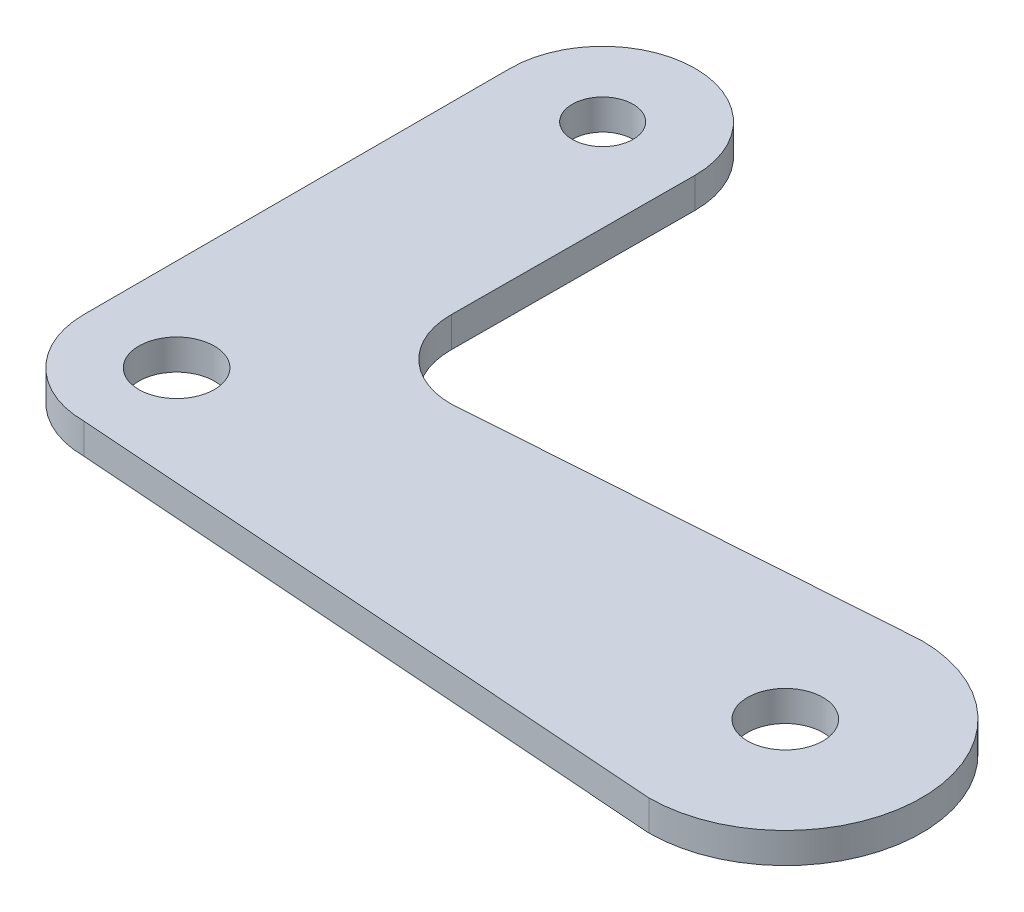
ISO-10303-21;
HEADER;
FILE_DESCRIPTION(('STEP AP214'),'2;1');
FILE_NAME('part.step','',(''),(''),'','','');
FILE_SCHEMA(('AUTOMOTIVE_DESIGN { 1 0 10303 214 1 1 1 1 }'));
ENDSEC;
DATA;
#1=APPLICATION_CONTEXT('core data for automotive mechanical design processes');
#2=APPLICATION_PROTOCOL_DEFINITION('international standard','automotive_design',2000,#1);
#3=PRODUCT_CONTEXT('',#1,'mechanical');
#4=PRODUCT('Part','Part','',(#3));
#5=PRODUCT_RELATED_PRODUCT_CATEGORY('part','',(#4));
#6=PRODUCT_DEFINITION_FORMATION('','',#4);
#7=PRODUCT_DEFINITION_CONTEXT('part definition',#1,'design');
#8=PRODUCT_DEFINITION('design','',#6,#7);
#9=PRODUCT_DEFINITION_SHAPE('','',#8);
#10=(LENGTH_UNIT() NAMED_UNIT(*) SI_UNIT(.MILLI.,.METRE.));
#11=(NAMED_UNIT(*) PLANE_ANGLE_UNIT() SI_UNIT($,.RADIAN.));
#12=(NAMED_UNIT(*) SI_UNIT($,.STERADIAN.) SOLID_ANGLE_UNIT());
#13=UNCERTAINTY_MEASURE_WITH_UNIT(LENGTH_MEASURE(1.E-05),#10,'distance_accuracy_value','');
#14=(GEOMETRIC_REPRESENTATION_CONTEXT(3) GLOBAL_UNCERTAINTY_ASSIGNED_CONTEXT((#13)) GLOBAL_UNIT_ASSIGNED_CONTEXT((#10,
#11,#12)) REPRESENTATION_CONTEXT('',''));
#15=CARTESIAN_POINT('',(0.,0.,0.));
#16=DIRECTION('',(0.,0.,1.));
#17=DIRECTION('',(1.,0.,0.));
#18=AXIS2_PLACEMENT_3D('',#15,#16,#17);
#19=CARTESIAN_POINT('',(-39.5657431192661,-3.175,3.69924361983811));
#20=DIRECTION('',(0.,1.,0.));
#21=DIRECTION('',(0.,0.,1.));
#22=AXIS2_PLACEMENT_3D('',#19,#20,#21);
#23=CYLINDRICAL_SURFACE('',#22,8.001);
#24=CARTESIAN_POINT('',(-39.5657431192661,0.,3.69924361983811));
#25=DIRECTION('',(0.,1.,0.));
#26=DIRECTION('',(0.,0.,1.));
#27=AXIS2_PLACEMENT_3D('',#24,#25,#26);
#28=CIRCLE('',#27,8.001);
#29=CARTESIAN_POINT('',(-47.5663430792671,0.,3.61923562003756));
#30=VERTEX_POINT('',#29);
#31=CARTESIAN_POINT('',(-38.4658783067437,0.,11.6242861051612));
#32=VERTEX_POINT('',#31);
#33=EDGE_CURVE('E142',#30,#32,#28,.T.);
#34=ORIENTED_EDGE('',*,*,#33,.T.);
#35=DIRECTION('',(0.,1.,0.));
#36=VECTOR('',#35,1.);
#37=CARTESIAN_POINT('',(-38.4658783067437,-3.175,11.6242861051612));
#38=LINE('',#37,#36);
#39=CARTESIAN_POINT('',(-38.4658783067437,-3.175,11.6242861051612));
#40=VERTEX_POINT('',#39);
#41=EDGE_CURVE('E11',#40,#32,#38,.T.);
#42=ORIENTED_EDGE('',*,*,#41,.F.);
#43=CARTESIAN_POINT('',(-39.5657431192661,-3.175,3.69924361983811));
#44=DIRECTION('',(0.,1.,0.));
#45=DIRECTION('',(0.,0.,1.));
#46=AXIS2_PLACEMENT_3D('',#43,#44,#45);
#47=CIRCLE('',#46,8.001);
#48=CARTESIAN_POINT('',(-47.5663430792671,-3.175,3.61923562003756));
#49=VERTEX_POINT('',#48);
#50=EDGE_CURVE('E53',#49,#40,#47,.T.);
#51=ORIENTED_EDGE('',*,*,#50,.F.);
#52=DIRECTION('',(0.,1.,0.));
#53=VECTOR('',#52,1.);
#54=CARTESIAN_POINT('',(-47.5663430792671,-3.175,3.61923562003756));
#55=LINE('',#54,#53);
#56=EDGE_CURVE('E38',#49,#30,#55,.T.);
#57=ORIENTED_EDGE('',*,*,#56,.T.);
#58=EDGE_LOOP('',(#34,#42,#51,#57));
#59=FACE_BOUND('',#58,.T.);
#60=ADVANCED_FACE('F35',(#59),#23,.F.);
#61=CARTESIAN_POINT('',(0.616383623404095,-3.175,8.92523486689127));
#62=DIRECTION('',(-0.0688966713520638,0.,-0.997623801177882));
#63=DIRECTION('',(-0.997623801177882,0.,0.0688966713520638));
#64=AXIS2_PLACEMENT_3D('',#61,#62,#63);
#65=PLANE('',#64);
#66=DIRECTION('',(-0.997623801177882,0.,0.0688966713520638));
#67=VECTOR('',#66,1.);
#68=CARTESIAN_POINT('',(0.616383623404095,0.,8.92523486689127));
#69=LINE('',#68,#67);
#70=CARTESIAN_POINT('',(6.40825688073394,0.,8.52524361983811));
#71=VERTEX_POINT('',#70);
#72=EDGE_CURVE('E158',#71,#32,#69,.T.);
#73=ORIENTED_EDGE('',*,*,#72,.F.);
#74=DIRECTION('',(0.,1.,0.));
#75=VECTOR('',#74,1.);
#76=CARTESIAN_POINT('',(6.40825688073394,-3.175,8.52524361983811));
#77=LINE('',#76,#75);
#78=CARTESIAN_POINT('',(6.40825688073394,-3.175,8.52524361983811));
#79=VERTEX_POINT('',#78);
#80=EDGE_CURVE('E44',#79,#71,#77,.T.);
#81=ORIENTED_EDGE('',*,*,#80,.F.);
#82=DIRECTION('',(-0.997623801177882,0.,0.0688966713520638));
#83=VECTOR('',#82,1.);
#84=CARTESIAN_POINT('',(0.616383623404095,-3.175,8.92523486689127));
#85=LINE('',#84,#83);
#86=EDGE_CURVE('E123',#79,#40,#85,.T.);
#87=ORIENTED_EDGE('',*,*,#86,.T.);
#88=ORIENTED_EDGE('',*,*,#41,.T.);
#89=EDGE_LOOP('',(#73,#81,#87,#88));
#90=FACE_BOUND('',#89,.T.);
#91=ADVANCED_FACE('F185',(#90),#65,.T.);
#92=CARTESIAN_POINT('',(6.40825688073394,-3.175,22.7492436198381));
#93=DIRECTION('',(0.,1.,0.));
#94=DIRECTION('',(0.,0.,1.));
#95=AXIS2_PLACEMENT_3D('',#92,#93,#94);
#96=CYLINDRICAL_SURFACE('',#95,14.224);
#97=CARTESIAN_POINT('',(6.40825688073394,0.,22.7492436198381));
#98=DIRECTION('',(0.,1.,0.));
#99=DIRECTION('',(0.,0.,1.));
#100=AXIS2_PLACEMENT_3D('',#97,#98,#99);
#101=CIRCLE('',#100,14.224);
#102=CARTESIAN_POINT('',(6.40825688073394,0.,36.9732436198381));
#103=VERTEX_POINT('',#102);
#104=EDGE_CURVE('E110',#103,#71,#101,.T.);
#105=ORIENTED_EDGE('',*,*,#104,.F.);
#106=DIRECTION('',(0.,1.,0.));
#107=VECTOR('',#106,1.);
#108=CARTESIAN_POINT('',(6.40825688073394,-3.175,36.9732436198381));
#109=LINE('',#108,#107);
#110=CARTESIAN_POINT('',(6.40825688073394,-3.175,36.9732436198381));
#111=VERTEX_POINT('',#110);
#112=EDGE_CURVE('E106',#111,#103,#109,.T.);
#113=ORIENTED_EDGE('',*,*,#112,.F.);
#114=CARTESIAN_POINT('',(6.40825688073394,-3.175,22.7492436198381));
#115=DIRECTION('',(0.,1.,0.));
#116=DIRECTION('',(0.,0.,1.));
#117=AXIS2_PLACEMENT_3D('',#114,#115,#116);
#118=CIRCLE('',#117,14.224);
#119=EDGE_CURVE('E109',#111,#79,#118,.T.);
#120=ORIENTED_EDGE('',*,*,#119,.T.);
#121=ORIENTED_EDGE('',*,*,#80,.T.);
#122=EDGE_LOOP('',(#105,#113,#120,#121));
#123=FACE_BOUND('',#122,.T.);
#124=ADVANCED_FACE('F108',(#123),#96,.T.);
#125=CARTESIAN_POINT('',(-2.61529544536983,-3.175,36.3235478523587));
#126=DIRECTION('',(-0.0718140984736979,0.,0.997418034356914));
#127=DIRECTION('',(0.997418034356914,0.,0.0718140984736979));
#128=AXIS2_PLACEMENT_3D('',#125,#126,#127);
#129=PLANE('',#128);
#130=DIRECTION('',(0.997418034356914,0.,0.0718140984736979));
#131=VECTOR('',#130,1.);
#132=CARTESIAN_POINT('',(-2.61529544536983,0.,36.3235478523587));
#133=LINE('',#132,#131);
#134=CARTESIAN_POINT('',(-57.0917431192661,0.,32.4012436198381));
#135=VERTEX_POINT('',#134);
#136=EDGE_CURVE('E155',#135,#103,#133,.T.);
#137=ORIENTED_EDGE('',*,*,#136,.F.);
#138=DIRECTION('',(0.,1.,0.));
#139=VECTOR('',#138,1.);
#140=CARTESIAN_POINT('',(-57.0917431192661,-3.175,32.4012436198381));
#141=LINE('',#140,#139);
#142=CARTESIAN_POINT('',(-57.0917431192661,-3.175,32.4012436198381));
#143=VERTEX_POINT('',#142);
#144=EDGE_CURVE('E115',#143,#135,#141,.T.);
#145=ORIENTED_EDGE('',*,*,#144,.F.);
#146=DIRECTION('',(0.997418034356914,0.,0.0718140984736979));
#147=VECTOR('',#146,1.);
#148=CARTESIAN_POINT('',(-2.61529544536983,-3.175,36.3235478523587));
#149=LINE('',#148,#147);
#150=EDGE_CURVE('E121',#143,#111,#149,.T.);
#151=ORIENTED_EDGE('',*,*,#150,.T.);
#152=ORIENTED_EDGE('',*,*,#112,.T.);
#153=EDGE_LOOP('',(#137,#145,#151,#152));
#154=FACE_BOUND('',#153,.T.);
#155=ADVANCED_FACE('F125',(#154),#129,.T.);
#156=CARTESIAN_POINT('',(-57.0917431192661,-3.175,22.7492436198381));
#157=DIRECTION('',(0.,1.,0.));
#158=DIRECTION('',(0.,0.,1.));
#159=AXIS2_PLACEMENT_3D('',#156,#157,#158);
#160=CYLINDRICAL_SURFACE('',#159,9.652);
#161=CARTESIAN_POINT('',(-57.0917431192661,0.,22.7492436198381));
#162=DIRECTION('',(0.,1.,0.));
#163=DIRECTION('',(0.,0.,1.));
#164=AXIS2_PLACEMENT_3D('',#161,#162,#163);
#165=CIRCLE('',#164,9.652);
#166=CARTESIAN_POINT('',(-66.7437431192661,0.,22.7492436198381));
#167=VERTEX_POINT('',#166);
#168=EDGE_CURVE('E152',#167,#135,#165,.T.);
#169=ORIENTED_EDGE('',*,*,#168,.F.);
#170=DIRECTION('',(0.,1.,0.));
#171=VECTOR('',#170,1.);
#172=CARTESIAN_POINT('',(-66.7437431192661,-3.175,22.7492436198381));
#173=LINE('',#172,#171);
#174=CARTESIAN_POINT('',(-66.7437431192661,-3.175,22.7492436198381));
#175=VERTEX_POINT('',#174);
#176=EDGE_CURVE('E172',#175,#167,#173,.T.);
#177=ORIENTED_EDGE('',*,*,#176,.F.);
#178=CARTESIAN_POINT('',(-57.0917431192661,-3.175,22.7492436198381));
#179=DIRECTION('',(0.,1.,0.));
#180=DIRECTION('',(0.,0.,1.));
#181=AXIS2_PLACEMENT_3D('',#178,#179,#180);
#182=CIRCLE('',#181,9.652);
#183=EDGE_CURVE('E126',#175,#143,#182,.T.);
#184=ORIENTED_EDGE('',*,*,#183,.T.);
#185=ORIENTED_EDGE('',*,*,#144,.T.);
#186=EDGE_LOOP('',(#169,#177,#184,#185));
#187=FACE_BOUND('',#186,.T.);
#188=ADVANCED_FACE('F199',(#187),#160,.T.);
#189=CARTESIAN_POINT('',(-66.7437431192661,-3.175,0.));
#190=DIRECTION('',(-1.,0.,0.));
#191=DIRECTION('',(0.,0.,1.));
#192=AXIS2_PLACEMENT_3D('',#189,#190,#191);
#193=PLANE('',#192);
#194=DIRECTION('',(0.,0.,1.));
#195=VECTOR('',#194,1.);
#196=CARTESIAN_POINT('',(-66.7437431192661,0.,0.));
#197=LINE('',#196,#195);
#198=CARTESIAN_POINT('',(-66.7437431192661,0.,-21.7007563801619));
#199=VERTEX_POINT('',#198);
#200=EDGE_CURVE('E149',#199,#167,#197,.T.);
#201=ORIENTED_EDGE('',*,*,#200,.F.);
#202=DIRECTION('',(0.,1.,0.));
#203=VECTOR('',#202,1.);
#204=CARTESIAN_POINT('',(-66.7437431192661,-3.175,-21.7007563801619));
#205=LINE('',#204,#203);
#206=CARTESIAN_POINT('',(-66.7437431192661,-3.175,-21.7007563801619));
#207=VERTEX_POINT('',#206);
#208=EDGE_CURVE('E174',#207,#199,#205,.T.);
#209=ORIENTED_EDGE('',*,*,#208,.F.);
#210=DIRECTION('',(0.,0.,1.));
#211=VECTOR('',#210,1.);
#212=CARTESIAN_POINT('',(-66.7437431192661,-3.175,0.));
#213=LINE('',#212,#211);
#214=EDGE_CURVE('E128',#207,#175,#213,.T.);
#215=ORIENTED_EDGE('',*,*,#214,.T.);
#216=ORIENTED_EDGE('',*,*,#176,.T.);
#217=EDGE_LOOP('',(#201,#209,#215,#216));
#218=FACE_BOUND('',#217,.T.);
#219=ADVANCED_FACE('F202',(#218),#193,.T.);
#220=CARTESIAN_POINT('',(-57.0917431192661,-3.175,-21.7007563801619));
#221=DIRECTION('',(0.,1.,0.));
#222=DIRECTION('',(0.,0.,1.));
#223=AXIS2_PLACEMENT_3D('',#220,#221,#222);
#224=CYLINDRICAL_SURFACE('',#223,9.652);
#225=CARTESIAN_POINT('',(-57.0917431192661,0.,-21.7007563801619));
#226=DIRECTION('',(0.,1.,0.));
#227=DIRECTION('',(0.,0.,1.));
#228=AXIS2_PLACEMENT_3D('',#225,#226,#227);
#229=CIRCLE('',#228,9.652);
#230=CARTESIAN_POINT('',(-47.4397431192661,0.,-21.7007563801619));
#231=VERTEX_POINT('',#230);
#232=EDGE_CURVE('E146',#231,#199,#229,.T.);
#233=ORIENTED_EDGE('',*,*,#232,.F.);
#234=DIRECTION('',(0.,1.,0.));
#235=VECTOR('',#234,1.);
#236=CARTESIAN_POINT('',(-47.4397431192661,-3.175,-21.7007563801619));
#237=LINE('',#236,#235);
#238=CARTESIAN_POINT('',(-47.4397431192661,-3.175,-21.7007563801619));
#239=VERTEX_POINT('',#238);
#240=EDGE_CURVE('E175',#239,#231,#237,.T.);
#241=ORIENTED_EDGE('',*,*,#240,.F.);
#242=CARTESIAN_POINT('',(-57.0917431192661,-3.175,-21.7007563801619));
#243=DIRECTION('',(0.,1.,0.));
#244=DIRECTION('',(0.,0.,1.));
#245=AXIS2_PLACEMENT_3D('',#242,#243,#244);
#246=CIRCLE('',#245,9.652);
#247=EDGE_CURVE('E319',#239,#207,#246,.T.);
#248=ORIENTED_EDGE('',*,*,#247,.T.);
#249=ORIENTED_EDGE('',*,*,#208,.T.);
#250=EDGE_LOOP('',(#233,#241,#248,#249));
#251=FACE_BOUND('',#250,.T.);
#252=ADVANCED_FACE('F206',(#251),#224,.T.);
#253=CARTESIAN_POINT('',(-57.0917431192661,-3.175,22.7492436198381));
#254=DIRECTION('',(0.,1.,0.));
#255=DIRECTION('',(0.,0.,1.));
#256=AXIS2_PLACEMENT_3D('',#253,#254,#255);
#257=CYLINDRICAL_SURFACE('',#256,3.93699999999999);
#258=CARTESIAN_POINT('',(-57.0917431192661,-3.175,22.7492436198381));
#259=DIRECTION('',(0.,1.,0.));
#260=DIRECTION('',(0.,0.,1.));
#261=AXIS2_PLACEMENT_3D('',#258,#259,#260);
#262=CIRCLE('',#261,3.93699999999999);
#263=CARTESIAN_POINT('',(-57.0917431192661,-3.175,26.6862436198381));
#264=VERTEX_POINT('',#263);
#265=EDGE_CURVE('E136',#264,#264,#262,.T.);
#266=ORIENTED_EDGE('',*,*,#265,.F.);
#267=EDGE_LOOP('',(#266));
#268=FACE_BOUND('',#267,.T.);
#269=CARTESIAN_POINT('',(-57.0917431192661,0.,22.7492436198381));
#270=DIRECTION('',(0.,1.,0.));
#271=DIRECTION('',(0.,0.,1.));
#272=AXIS2_PLACEMENT_3D('',#269,#270,#271);
#273=CIRCLE('',#272,3.93699999999999);
#274=CARTESIAN_POINT('',(-57.0917431192661,0.,26.6862436198381));
#275=VERTEX_POINT('',#274);
#276=EDGE_CURVE('E164',#275,#275,#273,.T.);
#277=ORIENTED_EDGE('',*,*,#276,.T.);
#278=EDGE_LOOP('',(#277));
#279=FACE_BOUND('',#278,.T.);
#280=ADVANCED_FACE('F209',(#268,#279),#257,.F.);
#281=CARTESIAN_POINT('',(6.40825688073394,-3.175,22.7492436198381));
#282=DIRECTION('',(0.,1.,0.));
#283=DIRECTION('',(0.,0.,1.));
#284=AXIS2_PLACEMENT_3D('',#281,#282,#283);
#285=CYLINDRICAL_SURFACE('',#284,3.937);
#286=CARTESIAN_POINT('',(6.40825688073394,-3.175,22.7492436198381));
#287=DIRECTION('',(0.,1.,0.));
#288=DIRECTION('',(0.,0.,1.));
#289=AXIS2_PLACEMENT_3D('',#286,#287,#288);
#290=CIRCLE('',#289,3.937);
#291=CARTESIAN_POINT('',(6.40825688073394,-3.175,26.6862436198381));
#292=VERTEX_POINT('',#291);
#293=EDGE_CURVE('E133',#292,#292,#290,.T.);
#294=ORIENTED_EDGE('',*,*,#293,.F.);
#295=EDGE_LOOP('',(#294));
#296=FACE_BOUND('',#295,.T.);
#297=CARTESIAN_POINT('',(6.40825688073394,0.,22.7492436198381));
#298=DIRECTION('',(0.,1.,0.));
#299=DIRECTION('',(0.,0.,1.));
#300=AXIS2_PLACEMENT_3D('',#297,#298,#299);
#301=CIRCLE('',#300,3.937);
#302=CARTESIAN_POINT('',(6.40825688073394,0.,26.6862436198381));
#303=VERTEX_POINT('',#302);
#304=EDGE_CURVE('E161',#303,#303,#301,.T.);
#305=ORIENTED_EDGE('',*,*,#304,.T.);
#306=EDGE_LOOP('',(#305));
#307=FACE_BOUND('',#306,.T.);
#308=ADVANCED_FACE('F194',(#296,#307),#285,.F.);
#309=CARTESIAN_POINT('',(-47.5470582247112,-3.175,-0.23773529112356));
#310=DIRECTION('',(-0.99998750023437,0.,-0.00499993750117193));
#311=DIRECTION('',(-0.00499993750117193,0.,0.99998750023437));
#312=AXIS2_PLACEMENT_3D('',#309,#310,#311);
#313=PLANE('',#312);
#314=DIRECTION('',(-0.00499993750117193,0.,0.99998750023437));
#315=VECTOR('',#314,1.);
#316=CARTESIAN_POINT('',(-47.5470582247112,0.,-0.23773529112356));
#317=LINE('',#316,#315);
#318=EDGE_CURVE('E144',#231,#30,#317,.T.);
#319=ORIENTED_EDGE('',*,*,#318,.T.);
#320=ORIENTED_EDGE('',*,*,#56,.F.);
#321=DIRECTION('',(-0.00499993750117193,0.,0.99998750023437));
#322=VECTOR('',#321,1.);
#323=CARTESIAN_POINT('',(-47.5470582247112,-3.175,-0.23773529112356));
#324=LINE('',#323,#322);
#325=EDGE_CURVE('E92',#239,#49,#324,.T.);
#326=ORIENTED_EDGE('',*,*,#325,.F.);
#327=ORIENTED_EDGE('',*,*,#240,.T.);
#328=EDGE_LOOP('',(#319,#320,#326,#327));
#329=FACE_BOUND('',#328,.T.);
#330=ADVANCED_FACE('F211',(#329),#313,.F.);
#331=CARTESIAN_POINT('',(-57.0917431192661,-3.175,-21.7007563801619));
#332=DIRECTION('',(0.,1.,0.));
#333=DIRECTION('',(0.,0.,1.));
#334=AXIS2_PLACEMENT_3D('',#331,#332,#333);
#335=CYLINDRICAL_SURFACE('',#334,3.175);
#336=CARTESIAN_POINT('',(-57.0917431192661,-3.175,-21.7007563801619));
#337=DIRECTION('',(0.,1.,0.));
#338=DIRECTION('',(0.,0.,1.));
#339=AXIS2_PLACEMENT_3D('',#336,#337,#338);
#340=CIRCLE('',#339,3.175);
#341=CARTESIAN_POINT('',(-57.0917431192661,-3.175,-18.5257563801619));
#342=VERTEX_POINT('',#341);
#343=EDGE_CURVE('E139',#342,#342,#340,.T.);
#344=ORIENTED_EDGE('',*,*,#343,.F.);
#345=EDGE_LOOP('',(#344));
#346=FACE_BOUND('',#345,.T.);
#347=CARTESIAN_POINT('',(-57.0917431192661,0.,-21.7007563801619));
#348=DIRECTION('',(0.,1.,0.));
#349=DIRECTION('',(0.,0.,1.));
#350=AXIS2_PLACEMENT_3D('',#347,#348,#349);
#351=CIRCLE('',#350,3.175);
#352=CARTESIAN_POINT('',(-57.0917431192661,0.,-18.5257563801619));
#353=VERTEX_POINT('',#352);
#354=EDGE_CURVE('E167',#353,#353,#351,.T.);
#355=ORIENTED_EDGE('',*,*,#354,.T.);
#356=EDGE_LOOP('',(#355));
#357=FACE_BOUND('',#356,.T.);
#358=ADVANCED_FACE('F213',(#346,#357),#335,.F.);
#359=CARTESIAN_POINT('',(0.,-3.175,0.));
#360=DIRECTION('',(0.,1.,0.));
#361=DIRECTION('',(0.,0.,1.));
#362=AXIS2_PLACEMENT_3D('',#359,#360,#361);
#363=PLANE('',#362);
#364=ORIENTED_EDGE('',*,*,#50,.T.);
#365=ORIENTED_EDGE('',*,*,#86,.F.);
#366=ORIENTED_EDGE('',*,*,#119,.F.);
#367=ORIENTED_EDGE('',*,*,#150,.F.);
#368=ORIENTED_EDGE('',*,*,#183,.F.);
#369=ORIENTED_EDGE('',*,*,#214,.F.);
#370=ORIENTED_EDGE('',*,*,#247,.F.);
#371=ORIENTED_EDGE('',*,*,#325,.T.);
#372=EDGE_LOOP('',(#364,#365,#366,#367,#368,#369,#370,#371));
#373=FACE_BOUND('',#372,.T.);
#374=ORIENTED_EDGE('',*,*,#293,.T.);
#375=EDGE_LOOP('',(#374));
#376=FACE_BOUND('',#375,.T.);
#377=ORIENTED_EDGE('',*,*,#265,.T.);
#378=EDGE_LOOP('',(#377));
#379=FACE_BOUND('',#378,.T.);
#380=ORIENTED_EDGE('',*,*,#343,.T.);
#381=EDGE_LOOP('',(#380));
#382=FACE_BOUND('',#381,.T.);
#383=ADVANCED_FACE('F118',(#373,#376,#379,#382),#363,.F.);
#384=CARTESIAN_POINT('',(0.,0.,0.));
#385=DIRECTION('',(0.,1.,0.));
#386=DIRECTION('',(0.,0.,1.));
#387=AXIS2_PLACEMENT_3D('',#384,#385,#386);
#388=PLANE('',#387);
#389=ORIENTED_EDGE('',*,*,#33,.F.);
#390=ORIENTED_EDGE('',*,*,#318,.F.);
#391=ORIENTED_EDGE('',*,*,#232,.T.);
#392=ORIENTED_EDGE('',*,*,#200,.T.);
#393=ORIENTED_EDGE('',*,*,#168,.T.);
#394=ORIENTED_EDGE('',*,*,#136,.T.);
#395=ORIENTED_EDGE('',*,*,#104,.T.);
#396=ORIENTED_EDGE('',*,*,#72,.T.);
#397=EDGE_LOOP('',(#389,#390,#391,#392,#393,#394,#395,#396));
#398=FACE_BOUND('',#397,.T.);
#399=ORIENTED_EDGE('',*,*,#304,.F.);
#400=EDGE_LOOP('',(#399));
#401=FACE_BOUND('',#400,.T.);
#402=ORIENTED_EDGE('',*,*,#276,.F.);
#403=EDGE_LOOP('',(#402));
#404=FACE_BOUND('',#403,.T.);
#405=ORIENTED_EDGE('',*,*,#354,.F.);
#406=EDGE_LOOP('',(#405));
#407=FACE_BOUND('',#406,.T.);
#408=ADVANCED_FACE('F182',(#398,#401,#404,#407),#388,.T.);
#409=CLOSED_SHELL('',(#60,#91,#124,#155,#188,#219,#252,#280,#308,#330,#358,#383,#408));
#410=MANIFOLD_SOLID_BREP('B2',#409);
#411=ADVANCED_BREP_SHAPE_REPRESENTATION('',(#18,#410),#14);
#412=SHAPE_DEFINITION_REPRESENTATION(#9,#411);
ENDSEC;
END-ISO-10303-21;
